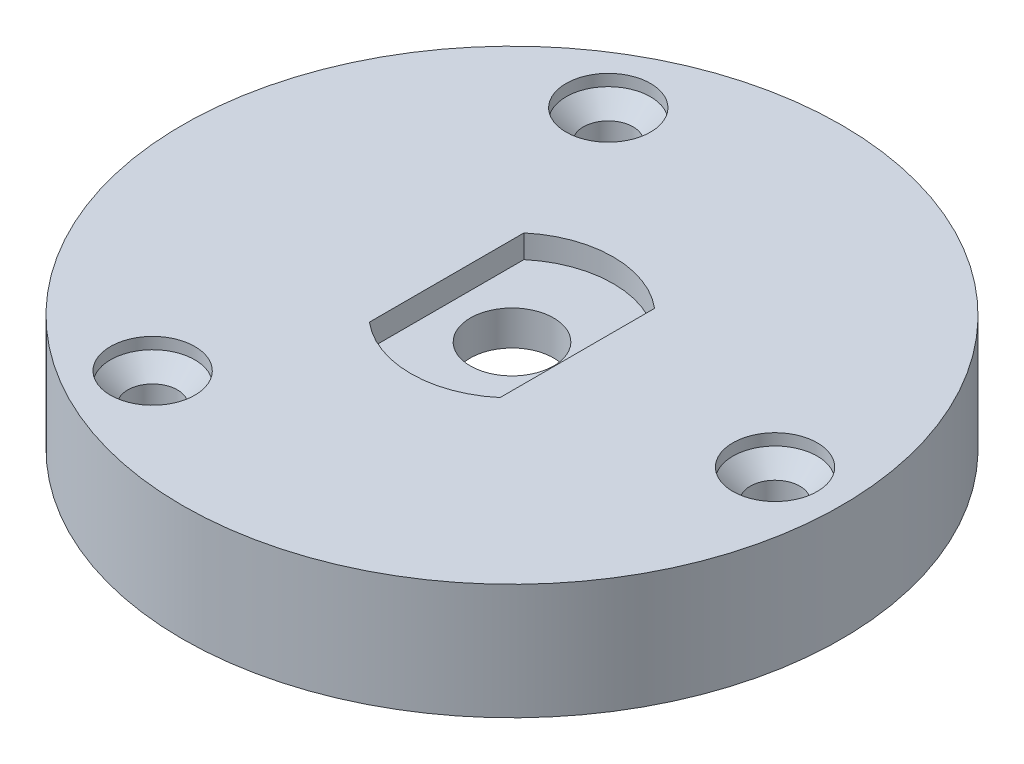
ISO-10303-21;
HEADER;
FILE_DESCRIPTION(('STEP AP214'),'2;1');
FILE_NAME('part.step','',(''),(''),'','','');
FILE_SCHEMA(('AUTOMOTIVE_DESIGN { 1 0 10303 214 1 1 1 1 }'));
ENDSEC;
DATA;
#1=APPLICATION_CONTEXT('core data for automotive mechanical design processes');
#2=APPLICATION_PROTOCOL_DEFINITION('international standard','automotive_design',2000,#1);
#3=PRODUCT_CONTEXT('',#1,'mechanical');
#4=PRODUCT('Part','Part','',(#3));
#5=PRODUCT_RELATED_PRODUCT_CATEGORY('part','',(#4));
#6=PRODUCT_DEFINITION_FORMATION('','',#4);
#7=PRODUCT_DEFINITION_CONTEXT('part definition',#1,'design');
#8=PRODUCT_DEFINITION('design','',#6,#7);
#9=PRODUCT_DEFINITION_SHAPE('','',#8);
#10=(LENGTH_UNIT() NAMED_UNIT(*) SI_UNIT(.MILLI.,.METRE.));
#11=(NAMED_UNIT(*) PLANE_ANGLE_UNIT() SI_UNIT($,.RADIAN.));
#12=(NAMED_UNIT(*) SI_UNIT($,.STERADIAN.) SOLID_ANGLE_UNIT());
#13=UNCERTAINTY_MEASURE_WITH_UNIT(LENGTH_MEASURE(1.E-05),#10,'distance_accuracy_value','');
#14=(GEOMETRIC_REPRESENTATION_CONTEXT(3) GLOBAL_UNCERTAINTY_ASSIGNED_CONTEXT((#13)) GLOBAL_UNIT_ASSIGNED_CONTEXT((#10,
#11,#12)) REPRESENTATION_CONTEXT('',''));
#15=CARTESIAN_POINT('',(0.,0.,0.));
#16=DIRECTION('',(0.,0.,1.));
#17=DIRECTION('',(1.,0.,0.));
#18=AXIS2_PLACEMENT_3D('',#15,#16,#17);
#19=CARTESIAN_POINT('',(22.75,0.,0.));
#20=DIRECTION('',(0.,1.,0.));
#21=DIRECTION('',(0.,0.,1.));
#22=AXIS2_PLACEMENT_3D('',#19,#20,#21);
#23=CYLINDRICAL_SURFACE('',#22,2.15);
#24=CARTESIAN_POINT('',(22.75,7.49999999999997,0.));
#25=DIRECTION('',(0.,1.,0.));
#26=DIRECTION('',(0.,0.,1.));
#27=AXIS2_PLACEMENT_3D('',#24,#25,#26);
#28=CIRCLE('',#27,2.15);
#29=CARTESIAN_POINT('',(22.75,7.49999999999997,2.15));
#30=VERTEX_POINT('',#29);
#31=EDGE_CURVE('E247',#30,#30,#28,.T.);
#32=ORIENTED_EDGE('',*,*,#31,.T.);
#33=EDGE_LOOP('',(#32));
#34=FACE_BOUND('',#33,.T.);
#35=CARTESIAN_POINT('',(22.75,0.,0.));
#36=DIRECTION('',(0.,1.,0.));
#37=DIRECTION('',(0.,0.,1.));
#38=AXIS2_PLACEMENT_3D('',#35,#36,#37);
#39=CIRCLE('',#38,2.15);
#40=CARTESIAN_POINT('',(22.75,0.,2.15));
#41=VERTEX_POINT('',#40);
#42=EDGE_CURVE('E279',#41,#41,#39,.T.);
#43=ORIENTED_EDGE('',*,*,#42,.F.);
#44=EDGE_LOOP('',(#43));
#45=FACE_BOUND('',#44,.T.);
#46=ADVANCED_FACE('F38',(#34,#45),#23,.F.);
#47=CARTESIAN_POINT('',(-11.3750000000001,0.,19.7020779360959));
#48=DIRECTION('',(0.,1.,0.));
#49=DIRECTION('',(0.,0.,1.));
#50=AXIS2_PLACEMENT_3D('',#47,#48,#49);
#51=CYLINDRICAL_SURFACE('',#50,2.15);
#52=CARTESIAN_POINT('',(-11.3750000000001,7.49999999999997,19.7020779360959));
#53=DIRECTION('',(0.,1.,0.));
#54=DIRECTION('',(0.,0.,1.));
#55=AXIS2_PLACEMENT_3D('',#52,#53,#54);
#56=CIRCLE('',#55,2.15);
#57=CARTESIAN_POINT('',(-11.3750000000001,7.49999999999997,21.8520779360959));
#58=VERTEX_POINT('',#57);
#59=EDGE_CURVE('E250',#58,#58,#56,.T.);
#60=ORIENTED_EDGE('',*,*,#59,.T.);
#61=EDGE_LOOP('',(#60));
#62=FACE_BOUND('',#61,.T.);
#63=CARTESIAN_POINT('',(-11.3750000000001,0.,19.7020779360959));
#64=DIRECTION('',(0.,1.,0.));
#65=DIRECTION('',(0.,0.,1.));
#66=AXIS2_PLACEMENT_3D('',#63,#64,#65);
#67=CIRCLE('',#66,2.15);
#68=CARTESIAN_POINT('',(-11.3750000000001,0.,21.8520779360959));
#69=VERTEX_POINT('',#68);
#70=EDGE_CURVE('E277',#69,#69,#67,.T.);
#71=ORIENTED_EDGE('',*,*,#70,.F.);
#72=EDGE_LOOP('',(#71));
#73=FACE_BOUND('',#72,.T.);
#74=ADVANCED_FACE('F270',(#62,#73),#51,.F.);
#75=CARTESIAN_POINT('',(-11.3749999999998,0.,-19.7020779360961));
#76=DIRECTION('',(0.,1.,0.));
#77=DIRECTION('',(0.,0.,1.));
#78=AXIS2_PLACEMENT_3D('',#75,#76,#77);
#79=CYLINDRICAL_SURFACE('',#78,2.15);
#80=CARTESIAN_POINT('',(-11.3749999999998,7.49999999999997,-19.7020779360961));
#81=DIRECTION('',(0.,1.,0.));
#82=DIRECTION('',(0.,0.,1.));
#83=AXIS2_PLACEMENT_3D('',#80,#81,#82);
#84=CIRCLE('',#83,2.15);
#85=CARTESIAN_POINT('',(-11.3749999999998,7.49999999999997,-17.5520779360961));
#86=VERTEX_POINT('',#85);
#87=EDGE_CURVE('E253',#86,#86,#84,.T.);
#88=ORIENTED_EDGE('',*,*,#87,.T.);
#89=EDGE_LOOP('',(#88));
#90=FACE_BOUND('',#89,.T.);
#91=CARTESIAN_POINT('',(-11.3749999999998,0.,-19.7020779360961));
#92=DIRECTION('',(0.,1.,0.));
#93=DIRECTION('',(0.,0.,1.));
#94=AXIS2_PLACEMENT_3D('',#91,#92,#93);
#95=CIRCLE('',#94,2.15);
#96=CARTESIAN_POINT('',(-11.3749999999998,0.,-17.5520779360961));
#97=VERTEX_POINT('',#96);
#98=EDGE_CURVE('E144',#97,#97,#95,.T.);
#99=ORIENTED_EDGE('',*,*,#98,.F.);
#100=EDGE_LOOP('',(#99));
#101=FACE_BOUND('',#100,.T.);
#102=ADVANCED_FACE('F273',(#90,#101),#79,.F.);
#103=CARTESIAN_POINT('',(0.,24.7867943770863,0.));
#104=DIRECTION('',(0.,1.,0.));
#105=DIRECTION('',(0.,0.,1.));
#106=AXIS2_PLACEMENT_3D('',#103,#104,#105);
#107=CYLINDRICAL_SURFACE('',#106,3.6);
#108=CARTESIAN_POINT('',(0.,5.,0.));
#109=DIRECTION('',(0.,1.,0.));
#110=DIRECTION('',(0.,0.,1.));
#111=AXIS2_PLACEMENT_3D('',#108,#109,#110);
#112=CIRCLE('',#111,3.6);
#113=CARTESIAN_POINT('',(0.,5.,3.6));
#114=VERTEX_POINT('',#113);
#115=EDGE_CURVE('E228',#114,#114,#112,.T.);
#116=ORIENTED_EDGE('',*,*,#115,.F.);
#117=EDGE_LOOP('',(#116));
#118=FACE_BOUND('',#117,.T.);
#119=CARTESIAN_POINT('',(0.,8.,0.));
#120=DIRECTION('',(0.,1.,0.));
#121=DIRECTION('',(0.,0.,1.));
#122=AXIS2_PLACEMENT_3D('',#119,#120,#121);
#123=CIRCLE('',#122,3.6);
#124=CARTESIAN_POINT('',(0.,8.,3.6));
#125=VERTEX_POINT('',#124);
#126=EDGE_CURVE('E195',#125,#125,#123,.F.);
#127=ORIENTED_EDGE('',*,*,#126,.F.);
#128=EDGE_LOOP('',(#127));
#129=FACE_BOUND('',#128,.T.);
#130=ADVANCED_FACE('F392',(#118,#129),#107,.F.);
#131=CARTESIAN_POINT('',(0.,5.,0.));
#132=DIRECTION('',(0.,-1.,0.));
#133=DIRECTION('',(0.,0.,-1.));
#134=AXIS2_PLACEMENT_3D('',#131,#132,#133);
#135=PLANE('',#134);
#136=ORIENTED_EDGE('',*,*,#115,.T.);
#137=EDGE_LOOP('',(#136));
#138=FACE_BOUND('',#137,.T.);
#139=CARTESIAN_POINT('',(0.,5.,0.));
#140=DIRECTION('',(0.,1.,0.));
#141=DIRECTION('',(0.,0.,1.));
#142=AXIS2_PLACEMENT_3D('',#139,#140,#141);
#143=CIRCLE('',#142,17.15);
#144=CARTESIAN_POINT('',(0.,5.,17.15));
#145=VERTEX_POINT('',#144);
#146=EDGE_CURVE('E225',#145,#145,#143,.T.);
#147=ORIENTED_EDGE('',*,*,#146,.F.);
#148=EDGE_LOOP('',(#147));
#149=FACE_BOUND('',#148,.T.);
#150=ADVANCED_FACE('F394',(#138,#149),#135,.T.);
#151=CARTESIAN_POINT('',(0.,24.7867943770863,0.));
#152=DIRECTION('',(0.,1.,0.));
#153=DIRECTION('',(0.,0.,1.));
#154=AXIS2_PLACEMENT_3D('',#151,#152,#153);
#155=CYLINDRICAL_SURFACE('',#154,17.15);
#156=ORIENTED_EDGE('',*,*,#146,.T.);
#157=EDGE_LOOP('',(#156));
#158=FACE_BOUND('',#157,.T.);
#159=CARTESIAN_POINT('',(0.,0.,0.));
#160=DIRECTION('',(0.,1.,0.));
#161=DIRECTION('',(0.,0.,1.));
#162=AXIS2_PLACEMENT_3D('',#159,#160,#161);
#163=CIRCLE('',#162,17.15);
#164=CARTESIAN_POINT('',(0.,0.,17.15));
#165=VERTEX_POINT('',#164);
#166=EDGE_CURVE('E222',#165,#165,#163,.T.);
#167=ORIENTED_EDGE('',*,*,#166,.F.);
#168=EDGE_LOOP('',(#167));
#169=FACE_BOUND('',#168,.T.);
#170=ADVANCED_FACE('F318',(#158,#169),#155,.F.);
#171=CARTESIAN_POINT('',(0.,0.,0.));
#172=DIRECTION('',(0.,-1.,0.));
#173=DIRECTION('',(0.,0.,-1.));
#174=AXIS2_PLACEMENT_3D('',#171,#172,#173);
#175=PLANE('',#174);
#176=ORIENTED_EDGE('',*,*,#98,.T.);
#177=EDGE_LOOP('',(#176));
#178=FACE_BOUND('',#177,.T.);
#179=ORIENTED_EDGE('',*,*,#70,.T.);
#180=EDGE_LOOP('',(#179));
#181=FACE_BOUND('',#180,.T.);
#182=ORIENTED_EDGE('',*,*,#42,.T.);
#183=EDGE_LOOP('',(#182));
#184=FACE_BOUND('',#183,.T.);
#185=ORIENTED_EDGE('',*,*,#166,.T.);
#186=EDGE_LOOP('',(#185));
#187=FACE_BOUND('',#186,.T.);
#188=CARTESIAN_POINT('',(0.,0.,0.));
#189=DIRECTION('',(0.,1.,0.));
#190=DIRECTION('',(0.,0.,1.));
#191=AXIS2_PLACEMENT_3D('',#188,#189,#190);
#192=CIRCLE('',#191,28.5);
#193=CARTESIAN_POINT('',(0.,0.,28.5));
#194=VERTEX_POINT('',#193);
#195=EDGE_CURVE('E219',#194,#194,#192,.T.);
#196=ORIENTED_EDGE('',*,*,#195,.F.);
#197=EDGE_LOOP('',(#196));
#198=FACE_BOUND('',#197,.T.);
#199=ADVANCED_FACE('F312',(#178,#181,#184,#187,#198),#175,.T.);
#200=CARTESIAN_POINT('',(0.,24.7867943770863,0.));
#201=DIRECTION('',(0.,1.,0.));
#202=DIRECTION('',(0.,0.,1.));
#203=AXIS2_PLACEMENT_3D('',#200,#201,#202);
#204=CYLINDRICAL_SURFACE('',#203,28.5);
#205=ORIENTED_EDGE('',*,*,#195,.T.);
#206=EDGE_LOOP('',(#205));
#207=FACE_BOUND('',#206,.T.);
#208=CARTESIAN_POINT('',(0.,10.,0.));
#209=DIRECTION('',(0.,1.,0.));
#210=DIRECTION('',(0.,0.,1.));
#211=AXIS2_PLACEMENT_3D('',#208,#209,#210);
#212=CIRCLE('',#211,28.5);
#213=CARTESIAN_POINT('',(0.,10.,28.5));
#214=VERTEX_POINT('',#213);
#215=EDGE_CURVE('E211',#214,#214,#212,.T.);
#216=ORIENTED_EDGE('',*,*,#215,.F.);
#217=EDGE_LOOP('',(#216));
#218=FACE_BOUND('',#217,.T.);
#219=ADVANCED_FACE('F301',(#207,#218),#204,.T.);
#220=CARTESIAN_POINT('',(0.,10.,0.));
#221=DIRECTION('',(0.,1.,0.));
#222=DIRECTION('',(0.,0.,1.));
#223=AXIS2_PLACEMENT_3D('',#220,#221,#222);
#224=PLANE('',#223);
#225=CARTESIAN_POINT('',(-11.3749999999998,10.,-19.7020779360961));
#226=DIRECTION('',(0.,1.,0.));
#227=DIRECTION('',(0.,0.,1.));
#228=AXIS2_PLACEMENT_3D('',#225,#226,#227);
#229=CIRCLE('',#228,3.65);
#230=CARTESIAN_POINT('',(-11.3749999999998,10.,-16.0520779360961));
#231=VERTEX_POINT('',#230);
#232=EDGE_CURVE('E284',#231,#231,#229,.T.);
#233=ORIENTED_EDGE('',*,*,#232,.F.);
#234=EDGE_LOOP('',(#233));
#235=FACE_BOUND('',#234,.T.);
#236=CARTESIAN_POINT('',(22.75,10.,0.));
#237=DIRECTION('',(0.,1.,0.));
#238=DIRECTION('',(0.,0.,1.));
#239=AXIS2_PLACEMENT_3D('',#236,#237,#238);
#240=CIRCLE('',#239,3.65);
#241=CARTESIAN_POINT('',(22.75,10.,3.65));
#242=VERTEX_POINT('',#241);
#243=EDGE_CURVE('E289',#242,#242,#240,.T.);
#244=ORIENTED_EDGE('',*,*,#243,.F.);
#245=EDGE_LOOP('',(#244));
#246=FACE_BOUND('',#245,.T.);
#247=CARTESIAN_POINT('',(-11.3750000000001,10.,19.7020779360959));
#248=DIRECTION('',(0.,1.,0.));
#249=DIRECTION('',(0.,0.,1.));
#250=AXIS2_PLACEMENT_3D('',#247,#248,#249);
#251=CIRCLE('',#250,3.65);
#252=CARTESIAN_POINT('',(-11.3750000000001,10.,23.3520779360959));
#253=VERTEX_POINT('',#252);
#254=EDGE_CURVE('E286',#253,#253,#251,.T.);
#255=ORIENTED_EDGE('',*,*,#254,.F.);
#256=EDGE_LOOP('',(#255));
#257=FACE_BOUND('',#256,.T.);
#258=CARTESIAN_POINT('',(0.,10.,0.));
#259=DIRECTION('',(0.,1.,0.));
#260=DIRECTION('',(0.,0.,1.));
#261=AXIS2_PLACEMENT_3D('',#258,#259,#260);
#262=CIRCLE('',#261,8.75);
#263=CARTESIAN_POINT('',(-5.65,10.,6.68131723539603));
#264=VERTEX_POINT('',#263);
#265=CARTESIAN_POINT('',(5.65,10.,6.68131723539603));
#266=VERTEX_POINT('',#265);
#267=EDGE_CURVE('E61',#264,#266,#262,.T.);
#268=ORIENTED_EDGE('',*,*,#267,.F.);
#269=DIRECTION('',(0.,0.,1.));
#270=VECTOR('',#269,1.);
#271=CARTESIAN_POINT('',(-5.65,10.,0.));
#272=LINE('',#271,#270);
#273=CARTESIAN_POINT('',(-5.65,10.,-6.68131723539603));
#274=VERTEX_POINT('',#273);
#275=EDGE_CURVE('E206',#274,#264,#272,.T.);
#276=ORIENTED_EDGE('',*,*,#275,.F.);
#277=CARTESIAN_POINT('',(0.,10.,0.));
#278=DIRECTION('',(0.,1.,0.));
#279=DIRECTION('',(0.,0.,1.));
#280=AXIS2_PLACEMENT_3D('',#277,#278,#279);
#281=CIRCLE('',#280,8.75);
#282=CARTESIAN_POINT('',(5.65,10.,-6.68131723539603));
#283=VERTEX_POINT('',#282);
#284=EDGE_CURVE('E203',#283,#274,#281,.T.);
#285=ORIENTED_EDGE('',*,*,#284,.F.);
#286=DIRECTION('',(0.,0.,1.));
#287=VECTOR('',#286,1.);
#288=CARTESIAN_POINT('',(5.65,10.,0.));
#289=LINE('',#288,#287);
#290=EDGE_CURVE('E200',#283,#266,#289,.T.);
#291=ORIENTED_EDGE('',*,*,#290,.T.);
#292=EDGE_LOOP('',(#268,#276,#285,#291));
#293=FACE_BOUND('',#292,.T.);
#294=ORIENTED_EDGE('',*,*,#215,.T.);
#295=EDGE_LOOP('',(#294));
#296=FACE_BOUND('',#295,.T.);
#297=ADVANCED_FACE('F297',(#235,#246,#257,#293,#296),#224,.T.);
#298=CARTESIAN_POINT('',(0.,8.,0.));
#299=DIRECTION('',(0.,1.,0.));
#300=DIRECTION('',(0.,0.,1.));
#301=AXIS2_PLACEMENT_3D('',#298,#299,#300);
#302=CYLINDRICAL_SURFACE('',#301,8.75);
#303=CARTESIAN_POINT('',(0.,8.,0.));
#304=DIRECTION('',(0.,1.,0.));
#305=DIRECTION('',(0.,0.,1.));
#306=AXIS2_PLACEMENT_3D('',#303,#304,#305);
#307=CIRCLE('',#306,8.75);
#308=CARTESIAN_POINT('',(0.94710947109471,8.,8.69859090024141));
#309=VERTEX_POINT('',#308);
#310=CARTESIAN_POINT('',(5.65,8.,6.68131723539603));
#311=VERTEX_POINT('',#310);
#312=EDGE_CURVE('E186',#309,#311,#307,.T.);
#313=ORIENTED_EDGE('',*,*,#312,.F.);
#314=DIRECTION('',(0.,1.,0.));
#315=VECTOR('',#314,1.);
#316=CARTESIAN_POINT('',(0.94710947109471,6.,8.69859090024141));
#317=LINE('',#316,#315);
#318=CARTESIAN_POINT('',(0.94710947109471,6.,8.69859090024141));
#319=VERTEX_POINT('',#318);
#320=EDGE_CURVE('E176',#319,#309,#317,.T.);
#321=ORIENTED_EDGE('',*,*,#320,.F.);
#322=CARTESIAN_POINT('',(0.,6.,0.));
#323=DIRECTION('',(0.,1.,0.));
#324=DIRECTION('',(0.,0.,1.));
#325=AXIS2_PLACEMENT_3D('',#322,#323,#324);
#326=CIRCLE('',#325,8.75);
#327=CARTESIAN_POINT('',(-0.947109471094712,6.,8.69859090024141));
#328=VERTEX_POINT('',#327);
#329=EDGE_CURVE('E151',#328,#319,#326,.T.);
#330=ORIENTED_EDGE('',*,*,#329,.F.);
#331=DIRECTION('',(0.,1.,0.));
#332=VECTOR('',#331,1.);
#333=CARTESIAN_POINT('',(-0.947109471094712,6.,8.69859090024141));
#334=LINE('',#333,#332);
#335=CARTESIAN_POINT('',(-0.947109471094712,8.,8.69859090024141));
#336=VERTEX_POINT('',#335);
#337=EDGE_CURVE('E178',#328,#336,#334,.T.);
#338=ORIENTED_EDGE('',*,*,#337,.T.);
#339=CARTESIAN_POINT('',(-5.65,8.,6.68131723539603));
#340=VERTEX_POINT('',#339);
#341=EDGE_CURVE('E182',#340,#336,#307,.T.);
#342=ORIENTED_EDGE('',*,*,#341,.F.);
#343=DIRECTION('',(0.,1.,0.));
#344=VECTOR('',#343,1.);
#345=CARTESIAN_POINT('',(-5.65,8.,6.68131723539603));
#346=LINE('',#345,#344);
#347=EDGE_CURVE('E209',#340,#264,#346,.T.);
#348=ORIENTED_EDGE('',*,*,#347,.T.);
#349=ORIENTED_EDGE('',*,*,#267,.T.);
#350=DIRECTION('',(0.,1.,0.));
#351=VECTOR('',#350,1.);
#352=CARTESIAN_POINT('',(5.65,8.,6.68131723539603));
#353=LINE('',#352,#351);
#354=EDGE_CURVE('E198',#311,#266,#353,.T.);
#355=ORIENTED_EDGE('',*,*,#354,.F.);
#356=EDGE_LOOP('',(#313,#321,#330,#338,#342,#348,#349,#355));
#357=FACE_BOUND('',#356,.T.);
#358=ADVANCED_FACE('F300',(#357),#302,.F.);
#359=CARTESIAN_POINT('',(-5.65,8.,0.));
#360=DIRECTION('',(-1.,0.,0.));
#361=DIRECTION('',(0.,0.,1.));
#362=AXIS2_PLACEMENT_3D('',#359,#360,#361);
#363=PLANE('',#362);
#364=ORIENTED_EDGE('',*,*,#275,.T.);
#365=ORIENTED_EDGE('',*,*,#347,.F.);
#366=DIRECTION('',(0.,0.,1.));
#367=VECTOR('',#366,1.);
#368=CARTESIAN_POINT('',(-5.65,8.,0.));
#369=LINE('',#368,#367);
#370=CARTESIAN_POINT('',(-5.65,8.,-6.68131723539603));
#371=VERTEX_POINT('',#370);
#372=EDGE_CURVE('E192',#371,#340,#369,.T.);
#373=ORIENTED_EDGE('',*,*,#372,.F.);
#374=DIRECTION('',(0.,1.,0.));
#375=VECTOR('',#374,1.);
#376=CARTESIAN_POINT('',(-5.65,8.,-6.68131723539603));
#377=LINE('',#376,#375);
#378=EDGE_CURVE('E212',#371,#274,#377,.T.);
#379=ORIENTED_EDGE('',*,*,#378,.T.);
#380=EDGE_LOOP('',(#364,#365,#373,#379));
#381=FACE_BOUND('',#380,.T.);
#382=ADVANCED_FACE('F360',(#381),#363,.F.);
#383=CARTESIAN_POINT('',(0.,8.,0.));
#384=DIRECTION('',(0.,1.,0.));
#385=DIRECTION('',(0.,0.,1.));
#386=AXIS2_PLACEMENT_3D('',#383,#384,#385);
#387=CYLINDRICAL_SURFACE('',#386,8.75);
#388=ORIENTED_EDGE('',*,*,#284,.T.);
#389=ORIENTED_EDGE('',*,*,#378,.F.);
#390=CARTESIAN_POINT('',(0.,8.,0.));
#391=DIRECTION('',(0.,1.,0.));
#392=DIRECTION('',(0.,0.,1.));
#393=AXIS2_PLACEMENT_3D('',#390,#391,#392);
#394=CIRCLE('',#393,8.75);
#395=CARTESIAN_POINT('',(5.65,8.,-6.68131723539603));
#396=VERTEX_POINT('',#395);
#397=EDGE_CURVE('E189',#396,#371,#394,.T.);
#398=ORIENTED_EDGE('',*,*,#397,.F.);
#399=DIRECTION('',(0.,1.,0.));
#400=VECTOR('',#399,1.);
#401=CARTESIAN_POINT('',(5.65,8.,-6.68131723539603));
#402=LINE('',#401,#400);
#403=EDGE_CURVE('E214',#396,#283,#402,.T.);
#404=ORIENTED_EDGE('',*,*,#403,.T.);
#405=EDGE_LOOP('',(#388,#389,#398,#404));
#406=FACE_BOUND('',#405,.T.);
#407=ADVANCED_FACE('F363',(#406),#387,.F.);
#408=CARTESIAN_POINT('',(5.65,8.,0.));
#409=DIRECTION('',(-1.,0.,0.));
#410=DIRECTION('',(0.,0.,1.));
#411=AXIS2_PLACEMENT_3D('',#408,#409,#410);
#412=PLANE('',#411);
#413=ORIENTED_EDGE('',*,*,#290,.F.);
#414=ORIENTED_EDGE('',*,*,#403,.F.);
#415=DIRECTION('',(0.,0.,1.));
#416=VECTOR('',#415,1.);
#417=CARTESIAN_POINT('',(5.65,8.,0.));
#418=LINE('',#417,#416);
#419=EDGE_CURVE('E185',#396,#311,#418,.T.);
#420=ORIENTED_EDGE('',*,*,#419,.T.);
#421=ORIENTED_EDGE('',*,*,#354,.T.);
#422=EDGE_LOOP('',(#413,#414,#420,#421));
#423=FACE_BOUND('',#422,.T.);
#424=ADVANCED_FACE('F358',(#423),#412,.T.);
#425=CARTESIAN_POINT('',(0.,8.,0.));
#426=DIRECTION('',(0.,1.,0.));
#427=DIRECTION('',(0.,0.,1.));
#428=AXIS2_PLACEMENT_3D('',#425,#426,#427);
#429=PLANE('',#428);
#430=CARTESIAN_POINT('',(0.88,8.,8.08223360216716));
#431=DIRECTION('',(0.,1.,0.));
#432=DIRECTION('',(0.,0.,1.));
#433=AXIS2_PLACEMENT_3D('',#430,#431,#432);
#434=CIRCLE('',#433,0.620000000000001);
#435=CARTESIAN_POINT('',(1.5,8.,8.08223360216716));
#436=VERTEX_POINT('',#435);
#437=EDGE_CURVE('E245',#309,#436,#434,.T.);
#438=ORIENTED_EDGE('',*,*,#437,.F.);
#439=ORIENTED_EDGE('',*,*,#312,.T.);
#440=ORIENTED_EDGE('',*,*,#419,.F.);
#441=ORIENTED_EDGE('',*,*,#397,.T.);
#442=ORIENTED_EDGE('',*,*,#372,.T.);
#443=ORIENTED_EDGE('',*,*,#341,.T.);
#444=CARTESIAN_POINT('',(-0.88,8.,8.08223360216716));
#445=DIRECTION('',(0.,1.,0.));
#446=DIRECTION('',(0.,0.,1.));
#447=AXIS2_PLACEMENT_3D('',#444,#445,#446);
#448=CIRCLE('',#447,0.620000000000001);
#449=CARTESIAN_POINT('',(-1.5,8.,8.08223360216716));
#450=VERTEX_POINT('',#449);
#451=EDGE_CURVE('E233',#336,#450,#448,.F.);
#452=ORIENTED_EDGE('',*,*,#451,.T.);
#453=DIRECTION('',(0.,0.,1.));
#454=VECTOR('',#453,1.);
#455=CARTESIAN_POINT('',(-1.50000000000001,8.,0.));
#456=LINE('',#455,#454);
#457=CARTESIAN_POINT('',(-1.5,8.,7.78));
#458=VERTEX_POINT('',#457);
#459=EDGE_CURVE('E231',#458,#450,#456,.T.);
#460=ORIENTED_EDGE('',*,*,#459,.F.);
#461=CARTESIAN_POINT('',(-0.92,8.,7.78));
#462=DIRECTION('',(0.,1.,0.));
#463=DIRECTION('',(0.,0.,1.));
#464=AXIS2_PLACEMENT_3D('',#461,#462,#463);
#465=CIRCLE('',#464,0.579999999999999);
#466=CARTESIAN_POINT('',(-0.92,8.,7.2));
#467=VERTEX_POINT('',#466);
#468=EDGE_CURVE('E133',#458,#467,#465,.F.);
#469=ORIENTED_EDGE('',*,*,#468,.T.);
#470=DIRECTION('',(1.,0.,0.));
#471=VECTOR('',#470,1.);
#472=CARTESIAN_POINT('',(0.,8.,7.2));
#473=LINE('',#472,#471);
#474=CARTESIAN_POINT('',(0.92,8.,7.2));
#475=VERTEX_POINT('',#474);
#476=EDGE_CURVE('E237',#467,#475,#473,.T.);
#477=ORIENTED_EDGE('',*,*,#476,.T.);
#478=CARTESIAN_POINT('',(0.92,8.,7.78));
#479=DIRECTION('',(0.,1.,0.));
#480=DIRECTION('',(0.,0.,1.));
#481=AXIS2_PLACEMENT_3D('',#478,#479,#480);
#482=CIRCLE('',#481,0.579999999999999);
#483=CARTESIAN_POINT('',(1.5,8.,7.78));
#484=VERTEX_POINT('',#483);
#485=EDGE_CURVE('E240',#484,#475,#482,.T.);
#486=ORIENTED_EDGE('',*,*,#485,.F.);
#487=DIRECTION('',(0.,0.,1.));
#488=VECTOR('',#487,1.);
#489=CARTESIAN_POINT('',(1.50000000000001,8.,0.));
#490=LINE('',#489,#488);
#491=EDGE_CURVE('E242',#484,#436,#490,.T.);
#492=ORIENTED_EDGE('',*,*,#491,.T.);
#493=EDGE_LOOP('',(#438,#439,#440,#441,#442,#443,#452,#460,#469,#477,#486,#492));
#494=FACE_BOUND('',#493,.T.);
#495=ORIENTED_EDGE('',*,*,#126,.T.);
#496=EDGE_LOOP('',(#495));
#497=FACE_BOUND('',#496,.T.);
#498=ADVANCED_FACE('F355',(#494,#497),#429,.T.);
#499=CARTESIAN_POINT('',(-0.92,6.,7.78));
#500=DIRECTION('',(0.,1.,0.));
#501=DIRECTION('',(0.,0.,1.));
#502=AXIS2_PLACEMENT_3D('',#499,#500,#501);
#503=CYLINDRICAL_SURFACE('',#502,0.579999999999999);
#504=DIRECTION('',(0.,1.,0.));
#505=VECTOR('',#504,1.);
#506=CARTESIAN_POINT('',(-1.5,6.,7.78));
#507=LINE('',#506,#505);
#508=CARTESIAN_POINT('',(-1.5,6.,7.78));
#509=VERTEX_POINT('',#508);
#510=EDGE_CURVE('E53',#509,#458,#507,.T.);
#511=ORIENTED_EDGE('',*,*,#510,.F.);
#512=CARTESIAN_POINT('',(-0.92,6.,7.78));
#513=DIRECTION('',(0.,1.,0.));
#514=DIRECTION('',(0.,0.,1.));
#515=AXIS2_PLACEMENT_3D('',#512,#513,#514);
#516=CIRCLE('',#515,0.579999999999999);
#517=CARTESIAN_POINT('',(-0.92,6.,7.2));
#518=VERTEX_POINT('',#517);
#519=EDGE_CURVE('E130',#509,#518,#516,.F.);
#520=ORIENTED_EDGE('',*,*,#519,.T.);
#521=DIRECTION('',(0.,1.,0.));
#522=VECTOR('',#521,1.);
#523=CARTESIAN_POINT('',(-0.92,6.,7.2));
#524=LINE('',#523,#522);
#525=EDGE_CURVE('E165',#518,#467,#524,.T.);
#526=ORIENTED_EDGE('',*,*,#525,.T.);
#527=ORIENTED_EDGE('',*,*,#468,.F.);
#528=EDGE_LOOP('',(#511,#520,#526,#527));
#529=FACE_BOUND('',#528,.T.);
#530=ADVANCED_FACE('F128',(#529),#503,.F.);
#531=CARTESIAN_POINT('',(0.,6.,7.2));
#532=DIRECTION('',(0.,0.,1.));
#533=DIRECTION('',(1.,0.,0.));
#534=AXIS2_PLACEMENT_3D('',#531,#532,#533);
#535=PLANE('',#534);
#536=ORIENTED_EDGE('',*,*,#525,.F.);
#537=DIRECTION('',(1.,0.,0.));
#538=VECTOR('',#537,1.);
#539=CARTESIAN_POINT('',(0.,6.,7.2));
#540=LINE('',#539,#538);
#541=CARTESIAN_POINT('',(0.92,6.,7.2));
#542=VERTEX_POINT('',#541);
#543=EDGE_CURVE('E136',#518,#542,#540,.T.);
#544=ORIENTED_EDGE('',*,*,#543,.T.);
#545=DIRECTION('',(0.,1.,0.));
#546=VECTOR('',#545,1.);
#547=CARTESIAN_POINT('',(0.92,6.,7.2));
#548=LINE('',#547,#546);
#549=EDGE_CURVE('E167',#542,#475,#548,.T.);
#550=ORIENTED_EDGE('',*,*,#549,.T.);
#551=ORIENTED_EDGE('',*,*,#476,.F.);
#552=EDGE_LOOP('',(#536,#544,#550,#551));
#553=FACE_BOUND('',#552,.T.);
#554=ADVANCED_FACE('F331',(#553),#535,.T.);
#555=CARTESIAN_POINT('',(0.92,6.,7.78));
#556=DIRECTION('',(0.,1.,0.));
#557=DIRECTION('',(0.,0.,1.));
#558=AXIS2_PLACEMENT_3D('',#555,#556,#557);
#559=CYLINDRICAL_SURFACE('',#558,0.579999999999999);
#560=ORIENTED_EDGE('',*,*,#485,.T.);
#561=ORIENTED_EDGE('',*,*,#549,.F.);
#562=CARTESIAN_POINT('',(0.92,6.,7.78));
#563=DIRECTION('',(0.,1.,0.));
#564=DIRECTION('',(0.,0.,1.));
#565=AXIS2_PLACEMENT_3D('',#562,#563,#564);
#566=CIRCLE('',#565,0.579999999999999);
#567=CARTESIAN_POINT('',(1.5,6.,7.78));
#568=VERTEX_POINT('',#567);
#569=EDGE_CURVE('E162',#568,#542,#566,.T.);
#570=ORIENTED_EDGE('',*,*,#569,.F.);
#571=DIRECTION('',(0.,1.,0.));
#572=VECTOR('',#571,1.);
#573=CARTESIAN_POINT('',(1.5,6.,7.78));
#574=LINE('',#573,#572);
#575=EDGE_CURVE('E170',#568,#484,#574,.T.);
#576=ORIENTED_EDGE('',*,*,#575,.T.);
#577=EDGE_LOOP('',(#560,#561,#570,#576));
#578=FACE_BOUND('',#577,.T.);
#579=ADVANCED_FACE('F334',(#578),#559,.F.);
#580=CARTESIAN_POINT('',(1.50000000000001,6.,0.));
#581=DIRECTION('',(-1.,0.,0.));
#582=DIRECTION('',(0.,0.,1.));
#583=AXIS2_PLACEMENT_3D('',#580,#581,#582);
#584=PLANE('',#583);
#585=ORIENTED_EDGE('',*,*,#575,.F.);
#586=DIRECTION('',(0.,0.,1.));
#587=VECTOR('',#586,1.);
#588=CARTESIAN_POINT('',(1.50000000000001,6.,0.));
#589=LINE('',#588,#587);
#590=CARTESIAN_POINT('',(1.5,6.,8.08223360216716));
#591=VERTEX_POINT('',#590);
#592=EDGE_CURVE('E160',#568,#591,#589,.T.);
#593=ORIENTED_EDGE('',*,*,#592,.T.);
#594=DIRECTION('',(0.,1.,0.));
#595=VECTOR('',#594,1.);
#596=CARTESIAN_POINT('',(1.5,6.,8.08223360216716));
#597=LINE('',#596,#595);
#598=EDGE_CURVE('E173',#591,#436,#597,.T.);
#599=ORIENTED_EDGE('',*,*,#598,.T.);
#600=ORIENTED_EDGE('',*,*,#491,.F.);
#601=EDGE_LOOP('',(#585,#593,#599,#600));
#602=FACE_BOUND('',#601,.T.);
#603=ADVANCED_FACE('F338',(#602),#584,.T.);
#604=CARTESIAN_POINT('',(0.88,6.,8.08223360216716));
#605=DIRECTION('',(0.,1.,0.));
#606=DIRECTION('',(0.,0.,1.));
#607=AXIS2_PLACEMENT_3D('',#604,#605,#606);
#608=CYLINDRICAL_SURFACE('',#607,0.620000000000001);
#609=ORIENTED_EDGE('',*,*,#437,.T.);
#610=ORIENTED_EDGE('',*,*,#598,.F.);
#611=CARTESIAN_POINT('',(0.88,6.,8.08223360216716));
#612=DIRECTION('',(0.,1.,0.));
#613=DIRECTION('',(0.,0.,1.));
#614=AXIS2_PLACEMENT_3D('',#611,#612,#613);
#615=CIRCLE('',#614,0.620000000000001);
#616=EDGE_CURVE('E157',#319,#591,#615,.T.);
#617=ORIENTED_EDGE('',*,*,#616,.F.);
#618=ORIENTED_EDGE('',*,*,#320,.T.);
#619=EDGE_LOOP('',(#609,#610,#617,#618));
#620=FACE_BOUND('',#619,.T.);
#621=ADVANCED_FACE('F342',(#620),#608,.F.);
#622=CARTESIAN_POINT('',(-0.88,6.,8.08223360216716));
#623=DIRECTION('',(0.,1.,0.));
#624=DIRECTION('',(0.,0.,1.));
#625=AXIS2_PLACEMENT_3D('',#622,#623,#624);
#626=CYLINDRICAL_SURFACE('',#625,0.620000000000001);
#627=ORIENTED_EDGE('',*,*,#337,.F.);
#628=CARTESIAN_POINT('',(-0.88,6.,8.08223360216716));
#629=DIRECTION('',(0.,1.,0.));
#630=DIRECTION('',(0.,0.,1.));
#631=AXIS2_PLACEMENT_3D('',#628,#629,#630);
#632=CIRCLE('',#631,0.620000000000001);
#633=CARTESIAN_POINT('',(-1.5,6.,8.08223360216716));
#634=VERTEX_POINT('',#633);
#635=EDGE_CURVE('E149',#328,#634,#632,.F.);
#636=ORIENTED_EDGE('',*,*,#635,.T.);
#637=DIRECTION('',(0.,1.,0.));
#638=VECTOR('',#637,1.);
#639=CARTESIAN_POINT('',(-1.5,6.,8.08223360216716));
#640=LINE('',#639,#638);
#641=EDGE_CURVE('E135',#634,#450,#640,.T.);
#642=ORIENTED_EDGE('',*,*,#641,.T.);
#643=ORIENTED_EDGE('',*,*,#451,.F.);
#644=EDGE_LOOP('',(#627,#636,#642,#643));
#645=FACE_BOUND('',#644,.T.);
#646=ADVANCED_FACE('F346',(#645),#626,.F.);
#647=CARTESIAN_POINT('',(-1.50000000000001,6.,0.));
#648=DIRECTION('',(-1.,0.,0.));
#649=DIRECTION('',(0.,0.,1.));
#650=AXIS2_PLACEMENT_3D('',#647,#648,#649);
#651=PLANE('',#650);
#652=ORIENTED_EDGE('',*,*,#459,.T.);
#653=ORIENTED_EDGE('',*,*,#641,.F.);
#654=DIRECTION('',(0.,0.,1.));
#655=VECTOR('',#654,1.);
#656=CARTESIAN_POINT('',(-1.50000000000001,6.,0.));
#657=LINE('',#656,#655);
#658=EDGE_CURVE('E142',#509,#634,#657,.T.);
#659=ORIENTED_EDGE('',*,*,#658,.F.);
#660=ORIENTED_EDGE('',*,*,#510,.T.);
#661=EDGE_LOOP('',(#652,#653,#659,#660));
#662=FACE_BOUND('',#661,.T.);
#663=ADVANCED_FACE('F147',(#662),#651,.F.);
#664=CARTESIAN_POINT('',(0.,6.,0.));
#665=DIRECTION('',(0.,1.,0.));
#666=DIRECTION('',(0.,0.,1.));
#667=AXIS2_PLACEMENT_3D('',#664,#665,#666);
#668=PLANE('',#667);
#669=ORIENTED_EDGE('',*,*,#519,.F.);
#670=ORIENTED_EDGE('',*,*,#658,.T.);
#671=ORIENTED_EDGE('',*,*,#635,.F.);
#672=ORIENTED_EDGE('',*,*,#329,.T.);
#673=ORIENTED_EDGE('',*,*,#616,.T.);
#674=ORIENTED_EDGE('',*,*,#592,.F.);
#675=ORIENTED_EDGE('',*,*,#569,.T.);
#676=ORIENTED_EDGE('',*,*,#543,.F.);
#677=EDGE_LOOP('',(#669,#670,#671,#672,#673,#674,#675,#676));
#678=FACE_BOUND('',#677,.T.);
#679=ADVANCED_FACE('F140',(#678),#668,.T.);
#680=CARTESIAN_POINT('',(-11.3749999999998,9.5,-19.7020779360961));
#681=DIRECTION('',(0.,1.,0.));
#682=DIRECTION('',(0.,0.,1.));
#683=AXIS2_PLACEMENT_3D('',#680,#681,#682);
#684=CYLINDRICAL_SURFACE('',#683,3.65);
#685=CARTESIAN_POINT('',(-11.3749999999998,8.99999999999998,-19.7020779360961));
#686=DIRECTION('',(0.,1.,0.));
#687=DIRECTION('',(0.,0.,1.));
#688=AXIS2_PLACEMENT_3D('',#685,#686,#687);
#689=CIRCLE('',#688,3.65);
#690=CARTESIAN_POINT('',(-11.3749999999998,8.99999999999998,-16.0520779360961));
#691=VERTEX_POINT('',#690);
#692=EDGE_CURVE('E11',#691,#691,#689,.F.);
#693=ORIENTED_EDGE('',*,*,#692,.T.);
#694=EDGE_LOOP('',(#693));
#695=FACE_BOUND('',#694,.T.);
#696=ORIENTED_EDGE('',*,*,#232,.T.);
#697=EDGE_LOOP('',(#696));
#698=FACE_BOUND('',#697,.T.);
#699=ADVANCED_FACE('F295',(#695,#698),#684,.F.);
#700=CARTESIAN_POINT('',(-11.3750000000001,9.5,19.7020779360959));
#701=DIRECTION('',(0.,1.,0.));
#702=DIRECTION('',(0.,0.,1.));
#703=AXIS2_PLACEMENT_3D('',#700,#701,#702);
#704=CYLINDRICAL_SURFACE('',#703,3.65);
#705=CARTESIAN_POINT('',(-11.3750000000001,8.99999999999998,19.7020779360959));
#706=DIRECTION('',(0.,1.,0.));
#707=DIRECTION('',(0.,0.,1.));
#708=AXIS2_PLACEMENT_3D('',#705,#706,#707);
#709=CIRCLE('',#708,3.65);
#710=CARTESIAN_POINT('',(-11.3750000000001,8.99999999999998,23.3520779360959));
#711=VERTEX_POINT('',#710);
#712=EDGE_CURVE('E46',#711,#711,#709,.F.);
#713=ORIENTED_EDGE('',*,*,#712,.T.);
#714=EDGE_LOOP('',(#713));
#715=FACE_BOUND('',#714,.T.);
#716=ORIENTED_EDGE('',*,*,#254,.T.);
#717=EDGE_LOOP('',(#716));
#718=FACE_BOUND('',#717,.T.);
#719=ADVANCED_FACE('F261',(#715,#718),#704,.F.);
#720=CARTESIAN_POINT('',(22.75,9.5,0.));
#721=DIRECTION('',(0.,1.,0.));
#722=DIRECTION('',(0.,0.,1.));
#723=AXIS2_PLACEMENT_3D('',#720,#721,#722);
#724=CYLINDRICAL_SURFACE('',#723,3.65);
#725=CARTESIAN_POINT('',(22.75,8.99999999999999,0.));
#726=DIRECTION('',(0.,1.,0.));
#727=DIRECTION('',(0.,0.,1.));
#728=AXIS2_PLACEMENT_3D('',#725,#726,#727);
#729=CIRCLE('',#728,3.65);
#730=CARTESIAN_POINT('',(22.75,8.99999999999999,3.65));
#731=VERTEX_POINT('',#730);
#732=EDGE_CURVE('E256',#731,#731,#729,.F.);
#733=ORIENTED_EDGE('',*,*,#732,.T.);
#734=EDGE_LOOP('',(#733));
#735=FACE_BOUND('',#734,.T.);
#736=ORIENTED_EDGE('',*,*,#243,.T.);
#737=EDGE_LOOP('',(#736));
#738=FACE_BOUND('',#737,.T.);
#739=ADVANCED_FACE('F408',(#735,#738),#724,.F.);
#740=CARTESIAN_POINT('',(22.75,7.49999999999997,0.));
#741=DIRECTION('',(0.,1.,0.));
#742=DIRECTION('',(0.,0.,1.));
#743=AXIS2_PLACEMENT_3D('',#740,#741,#742);
#744=CONICAL_SURFACE('',#743,2.15,0.785398163397443);
#745=ORIENTED_EDGE('',*,*,#732,.F.);
#746=EDGE_LOOP('',(#745));
#747=FACE_BOUND('',#746,.T.);
#748=ORIENTED_EDGE('',*,*,#31,.F.);
#749=EDGE_LOOP('',(#748));
#750=FACE_BOUND('',#749,.T.);
#751=ADVANCED_FACE('F267',(#747,#750),#744,.F.);
#752=CARTESIAN_POINT('',(-11.3750000000001,7.49999999999997,19.7020779360959));
#753=DIRECTION('',(0.,1.,0.));
#754=DIRECTION('',(0.,0.,1.));
#755=AXIS2_PLACEMENT_3D('',#752,#753,#754);
#756=CONICAL_SURFACE('',#755,2.15,0.785398163397443);
#757=ORIENTED_EDGE('',*,*,#712,.F.);
#758=EDGE_LOOP('',(#757));
#759=FACE_BOUND('',#758,.T.);
#760=ORIENTED_EDGE('',*,*,#59,.F.);
#761=EDGE_LOOP('',(#760));
#762=FACE_BOUND('',#761,.T.);
#763=ADVANCED_FACE('F264',(#759,#762),#756,.F.);
#764=CARTESIAN_POINT('',(-11.3749999999998,7.49999999999997,-19.7020779360961));
#765=DIRECTION('',(0.,1.,0.));
#766=DIRECTION('',(0.,0.,1.));
#767=AXIS2_PLACEMENT_3D('',#764,#765,#766);
#768=CONICAL_SURFACE('',#767,2.15,0.785398163397443);
#769=ORIENTED_EDGE('',*,*,#692,.F.);
#770=EDGE_LOOP('',(#769));
#771=FACE_BOUND('',#770,.T.);
#772=ORIENTED_EDGE('',*,*,#87,.F.);
#773=EDGE_LOOP('',(#772));
#774=FACE_BOUND('',#773,.T.);
#775=ADVANCED_FACE('F40',(#771,#774),#768,.F.);
#776=CLOSED_SHELL('',(#46,#74,#102,#130,#150,#170,#199,#219,#297,#358,#382,#407,#424,#498,#530,
#554,#579,#603,#621,#646,#663,#679,#699,#719,#739,#751,#763,#775));
#777=MANIFOLD_SOLID_BREP('B2',#776);
#778=ADVANCED_BREP_SHAPE_REPRESENTATION('',(#18,#777),#14);
#779=SHAPE_DEFINITION_REPRESENTATION(#9,#778);
ENDSEC;
END-ISO-10303-21;
